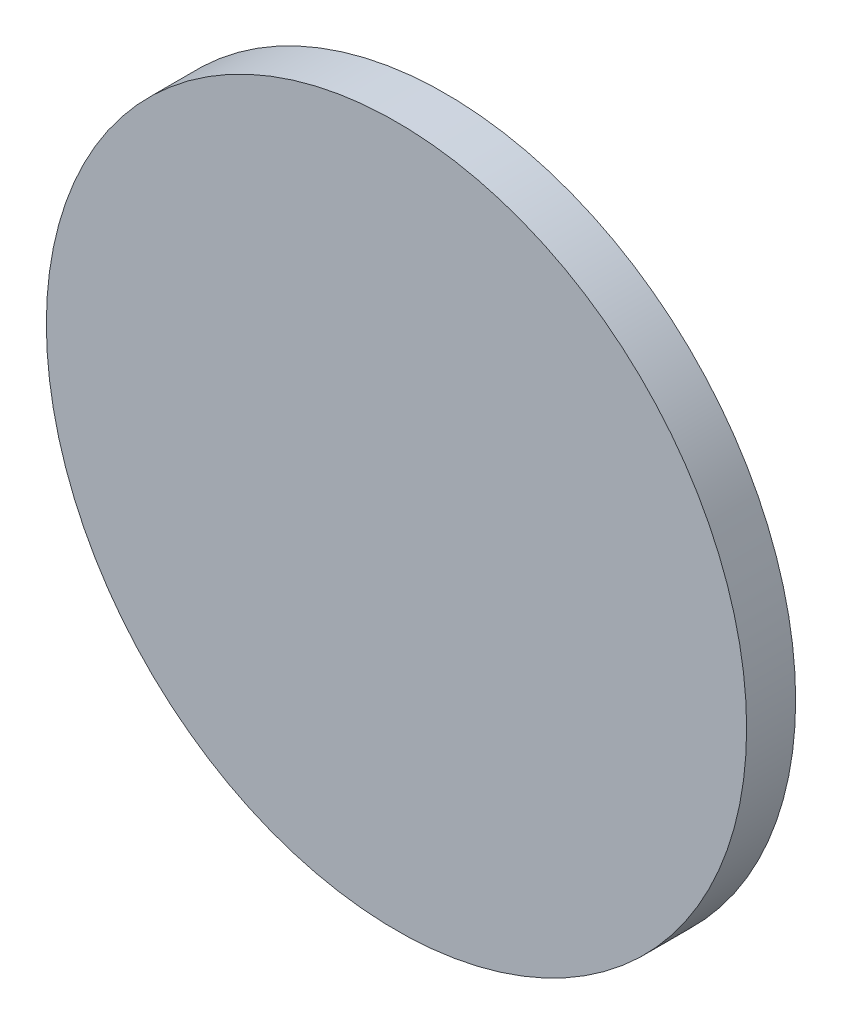
ISO-10303-21;
HEADER;
FILE_DESCRIPTION(('STEP AP214'),'2;1');
FILE_NAME('part.step','',(''),(''),'','','');
FILE_SCHEMA(('AUTOMOTIVE_DESIGN { 1 0 10303 214 1 1 1 1 }'));
ENDSEC;
DATA;
#1=APPLICATION_CONTEXT('core data for automotive mechanical design processes');
#2=APPLICATION_PROTOCOL_DEFINITION('international standard','automotive_design',2000,#1);
#3=PRODUCT_CONTEXT('',#1,'mechanical');
#4=PRODUCT('Part','Part','',(#3));
#5=PRODUCT_RELATED_PRODUCT_CATEGORY('part','',(#4));
#6=PRODUCT_DEFINITION_FORMATION('','',#4);
#7=PRODUCT_DEFINITION_CONTEXT('part definition',#1,'design');
#8=PRODUCT_DEFINITION('design','',#6,#7);
#9=PRODUCT_DEFINITION_SHAPE('','',#8);
#10=(LENGTH_UNIT() NAMED_UNIT(*) SI_UNIT(.MILLI.,.METRE.));
#11=(NAMED_UNIT(*) PLANE_ANGLE_UNIT() SI_UNIT($,.RADIAN.));
#12=(NAMED_UNIT(*) SI_UNIT($,.STERADIAN.) SOLID_ANGLE_UNIT());
#13=UNCERTAINTY_MEASURE_WITH_UNIT(LENGTH_MEASURE(1.E-05),#10,'distance_accuracy_value','');
#14=(GEOMETRIC_REPRESENTATION_CONTEXT(3) GLOBAL_UNCERTAINTY_ASSIGNED_CONTEXT((#13)) GLOBAL_UNIT_ASSIGNED_CONTEXT((#10,
#11,#12)) REPRESENTATION_CONTEXT('',''));
#15=CARTESIAN_POINT('',(0.,0.,0.));
#16=DIRECTION('',(0.,0.,1.));
#17=DIRECTION('',(1.,0.,0.));
#18=AXIS2_PLACEMENT_3D('',#15,#16,#17);
#19=CARTESIAN_POINT('',(0.5,0.,0.));
#20=DIRECTION('',(0.,0.,-1.));
#21=DIRECTION('',(-1.,0.,0.));
#22=AXIS2_PLACEMENT_3D('',#19,#20,#21);
#23=PLANE('',#22);
#24=CARTESIAN_POINT('',(0.,0.,0.));
#25=DIRECTION('',(0.,0.,-1.));
#26=DIRECTION('',(-1.,0.,0.));
#27=AXIS2_PLACEMENT_3D('',#24,#25,#26);
#28=CIRCLE('',#27,0.5);
#29=CARTESIAN_POINT('',(-0.5,0.,0.));
#30=VERTEX_POINT('',#29);
#31=EDGE_CURVE('E18',#30,#30,#28,.F.);
#32=ORIENTED_EDGE('',*,*,#31,.F.);
#33=EDGE_LOOP('',(#32));
#34=FACE_BOUND('',#33,.T.);
#35=ADVANCED_FACE('F15',(#34),#23,.T.);
#36=CARTESIAN_POINT('',(0.,0.,0.));
#37=DIRECTION('',(0.,0.,-1.));
#38=DIRECTION('',(-1.,0.,0.));
#39=AXIS2_PLACEMENT_3D('',#36,#37,#38);
#40=CYLINDRICAL_SURFACE('',#39,0.5);
#41=ORIENTED_EDGE('',*,*,#31,.T.);
#42=EDGE_LOOP('',(#41));
#43=FACE_BOUND('',#42,.T.);
#44=CARTESIAN_POINT('',(0.,0.,0.07));
#45=DIRECTION('',(0.,0.,-1.));
#46=DIRECTION('',(-1.,0.,0.));
#47=AXIS2_PLACEMENT_3D('',#44,#45,#46);
#48=CIRCLE('',#47,0.5);
#49=CARTESIAN_POINT('',(-0.5,0.,0.07));
#50=VERTEX_POINT('',#49);
#51=EDGE_CURVE('E10',#50,#50,#48,.T.);
#52=ORIENTED_EDGE('',*,*,#51,.T.);
#53=EDGE_LOOP('',(#52));
#54=FACE_BOUND('',#53,.T.);
#55=ADVANCED_FACE('F27',(#43,#54),#40,.T.);
#56=CARTESIAN_POINT('',(0.5,0.,0.07));
#57=DIRECTION('',(0.,0.,-1.));
#58=DIRECTION('',(-1.,0.,0.));
#59=AXIS2_PLACEMENT_3D('',#56,#57,#58);
#60=PLANE('',#59);
#61=ORIENTED_EDGE('',*,*,#51,.F.);
#62=EDGE_LOOP('',(#61));
#63=FACE_BOUND('',#62,.T.);
#64=ADVANCED_FACE('F34',(#63),#60,.F.);
#65=CLOSED_SHELL('',(#35,#55,#64));
#66=MANIFOLD_SOLID_BREP('B1',#65);
#67=ADVANCED_BREP_SHAPE_REPRESENTATION('',(#18,#66),#14);
#68=SHAPE_DEFINITION_REPRESENTATION(#9,#67);
ENDSEC;
END-ISO-10303-21;
